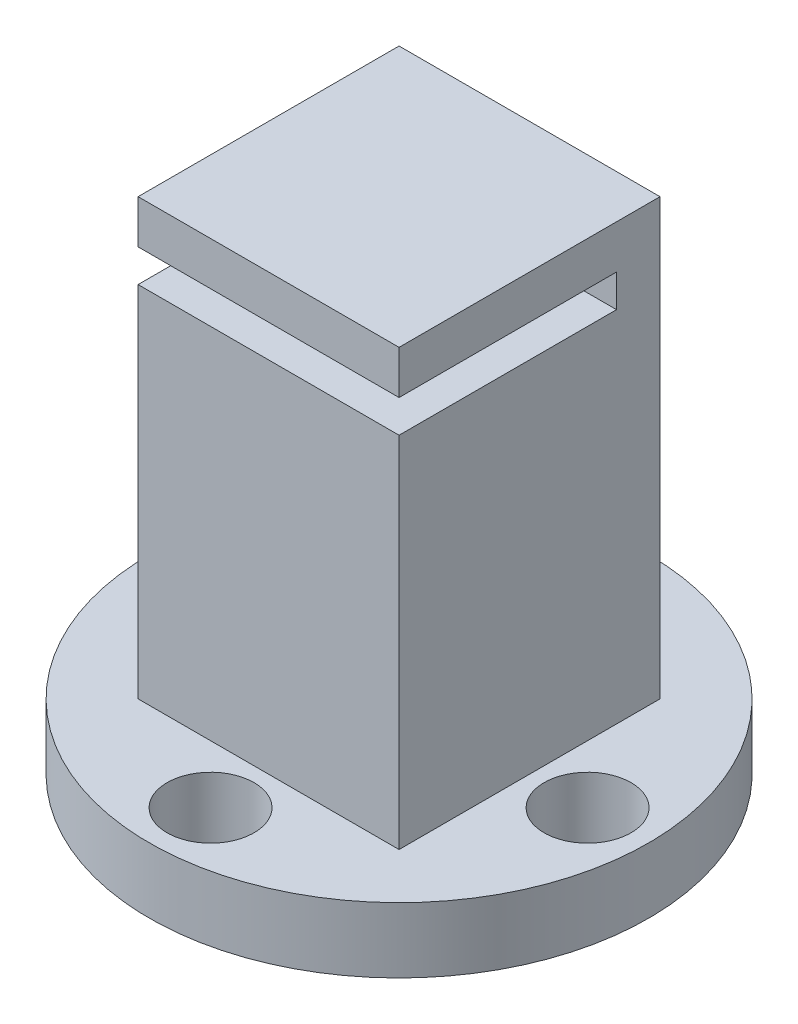
ISO-10303-21;
HEADER;
FILE_DESCRIPTION(('STEP AP214'),'2;1');
FILE_NAME('part.step','',(''),(''),'','','');
FILE_SCHEMA(('AUTOMOTIVE_DESIGN { 1 0 10303 214 1 1 1 1 }'));
ENDSEC;
DATA;
#1=APPLICATION_CONTEXT('core data for automotive mechanical design processes');
#2=APPLICATION_PROTOCOL_DEFINITION('international standard','automotive_design',2000,#1);
#3=PRODUCT_CONTEXT('',#1,'mechanical');
#4=PRODUCT('Part','Part','',(#3));
#5=PRODUCT_RELATED_PRODUCT_CATEGORY('part','',(#4));
#6=PRODUCT_DEFINITION_FORMATION('','',#4);
#7=PRODUCT_DEFINITION_CONTEXT('part definition',#1,'design');
#8=PRODUCT_DEFINITION('design','',#6,#7);
#9=PRODUCT_DEFINITION_SHAPE('','',#8);
#10=(LENGTH_UNIT() NAMED_UNIT(*) SI_UNIT(.MILLI.,.METRE.));
#11=(NAMED_UNIT(*) PLANE_ANGLE_UNIT() SI_UNIT($,.RADIAN.));
#12=(NAMED_UNIT(*) SI_UNIT($,.STERADIAN.) SOLID_ANGLE_UNIT());
#13=UNCERTAINTY_MEASURE_WITH_UNIT(LENGTH_MEASURE(1.E-05),#10,'distance_accuracy_value','');
#14=(GEOMETRIC_REPRESENTATION_CONTEXT(3) GLOBAL_UNCERTAINTY_ASSIGNED_CONTEXT((#13)) GLOBAL_UNIT_ASSIGNED_CONTEXT((#10,
#11,#12)) REPRESENTATION_CONTEXT('',''));
#15=CARTESIAN_POINT('',(0.,0.,0.));
#16=DIRECTION('',(0.,0.,1.));
#17=DIRECTION('',(1.,0.,0.));
#18=AXIS2_PLACEMENT_3D('',#15,#16,#17);
#19=CARTESIAN_POINT('',(0.,20.,0.));
#20=DIRECTION('',(0.,0.,-1.));
#21=DIRECTION('',(-1.,0.,0.));
#22=AXIS2_PLACEMENT_3D('',#19,#20,#21);
#23=PLANE('',#22);
#24=DIRECTION('',(0.,-1.,0.));
#25=VECTOR('',#24,1.);
#26=CARTESIAN_POINT('',(0.,20.,0.));
#27=LINE('',#26,#25);
#28=CARTESIAN_POINT('',(0.,20.,0.));
#29=VERTEX_POINT('',#28);
#30=CARTESIAN_POINT('',(0.,18.,0.));
#31=VERTEX_POINT('',#30);
#32=EDGE_CURVE('E11',#29,#31,#27,.T.);
#33=ORIENTED_EDGE('',*,*,#32,.T.);
#34=DIRECTION('',(-1.,0.,0.));
#35=VECTOR('',#34,1.);
#36=CARTESIAN_POINT('',(0.,18.,0.));
#37=LINE('',#36,#35);
#38=CARTESIAN_POINT('',(12.,18.,0.));
#39=VERTEX_POINT('',#38);
#40=EDGE_CURVE('E121',#39,#31,#37,.T.);
#41=ORIENTED_EDGE('',*,*,#40,.F.);
#42=DIRECTION('',(0.,-1.,0.));
#43=VECTOR('',#42,1.);
#44=CARTESIAN_POINT('',(12.,20.,0.));
#45=LINE('',#44,#43);
#46=CARTESIAN_POINT('',(12.,20.,0.));
#47=VERTEX_POINT('',#46);
#48=EDGE_CURVE('E120',#47,#39,#45,.T.);
#49=ORIENTED_EDGE('',*,*,#48,.F.);
#50=DIRECTION('',(1.,0.,0.));
#51=VECTOR('',#50,1.);
#52=CARTESIAN_POINT('',(0.,20.,0.));
#53=LINE('',#52,#51);
#54=EDGE_CURVE('E106',#29,#47,#53,.T.);
#55=ORIENTED_EDGE('',*,*,#54,.F.);
#56=EDGE_LOOP('',(#33,#41,#49,#55));
#57=FACE_BOUND('',#56,.T.);
#58=ADVANCED_FACE('F39',(#57),#23,.F.);
#59=CARTESIAN_POINT('',(0.,20.,0.));
#60=DIRECTION('',(1.,0.,0.));
#61=DIRECTION('',(0.,0.,-1.));
#62=AXIS2_PLACEMENT_3D('',#59,#60,#61);
#63=PLANE('',#62);
#64=DIRECTION('',(0.,-1.,0.));
#65=VECTOR('',#64,1.);
#66=CARTESIAN_POINT('',(0.,18.,-10.));
#67=LINE('',#66,#65);
#68=CARTESIAN_POINT('',(0.,18.,-10.));
#69=VERTEX_POINT('',#68);
#70=CARTESIAN_POINT('',(0.,16.5,-10.));
#71=VERTEX_POINT('',#70);
#72=EDGE_CURVE('E179',#69,#71,#67,.T.);
#73=ORIENTED_EDGE('',*,*,#72,.F.);
#74=DIRECTION('',(0.,0.,1.));
#75=VECTOR('',#74,1.);
#76=CARTESIAN_POINT('',(0.,18.,-10.));
#77=LINE('',#76,#75);
#78=EDGE_CURVE('E88',#69,#31,#77,.T.);
#79=ORIENTED_EDGE('',*,*,#78,.T.);
#80=ORIENTED_EDGE('',*,*,#32,.F.);
#81=DIRECTION('',(0.,0.,1.));
#82=VECTOR('',#81,1.);
#83=CARTESIAN_POINT('',(0.,20.,0.));
#84=LINE('',#83,#82);
#85=CARTESIAN_POINT('',(0.,20.,-12.));
#86=VERTEX_POINT('',#85);
#87=EDGE_CURVE('E113',#86,#29,#84,.T.);
#88=ORIENTED_EDGE('',*,*,#87,.F.);
#89=DIRECTION('',(0.,-1.,0.));
#90=VECTOR('',#89,1.);
#91=CARTESIAN_POINT('',(0.,20.,-12.));
#92=LINE('',#91,#90);
#93=CARTESIAN_POINT('',(0.,0.,-12.));
#94=VERTEX_POINT('',#93);
#95=EDGE_CURVE('E132',#86,#94,#92,.T.);
#96=ORIENTED_EDGE('',*,*,#95,.T.);
#97=DIRECTION('',(0.,0.,1.));
#98=VECTOR('',#97,1.);
#99=CARTESIAN_POINT('',(0.,0.,0.));
#100=LINE('',#99,#98);
#101=CARTESIAN_POINT('',(0.,0.,0.));
#102=VERTEX_POINT('',#101);
#103=EDGE_CURVE('E136',#94,#102,#100,.T.);
#104=ORIENTED_EDGE('',*,*,#103,.T.);
#105=CARTESIAN_POINT('',(0.,16.5,0.));
#106=VERTEX_POINT('',#105);
#107=EDGE_CURVE('E48',#106,#102,#27,.T.);
#108=ORIENTED_EDGE('',*,*,#107,.F.);
#109=DIRECTION('',(0.,0.,1.));
#110=VECTOR('',#109,1.);
#111=CARTESIAN_POINT('',(0.,16.5,-10.));
#112=LINE('',#111,#110);
#113=EDGE_CURVE('E176',#71,#106,#112,.T.);
#114=ORIENTED_EDGE('',*,*,#113,.F.);
#115=EDGE_LOOP('',(#73,#79,#80,#88,#96,#104,#108,#114));
#116=FACE_BOUND('',#115,.T.);
#117=ADVANCED_FACE('F41',(#116),#63,.F.);
#118=CARTESIAN_POINT('',(12.,16.5,0.));
#119=VERTEX_POINT('',#118);
#120=CARTESIAN_POINT('',(12.,0.,0.));
#121=VERTEX_POINT('',#120);
#122=EDGE_CURVE('E125',#119,#121,#45,.T.);
#123=ORIENTED_EDGE('',*,*,#122,.F.);
#124=DIRECTION('',(1.,0.,0.));
#125=VECTOR('',#124,1.);
#126=CARTESIAN_POINT('',(0.,16.5,0.));
#127=LINE('',#126,#125);
#128=EDGE_CURVE('E202',#106,#119,#127,.T.);
#129=ORIENTED_EDGE('',*,*,#128,.F.);
#130=ORIENTED_EDGE('',*,*,#107,.T.);
#131=DIRECTION('',(1.,0.,0.));
#132=VECTOR('',#131,1.);
#133=CARTESIAN_POINT('',(0.,0.,0.));
#134=LINE('',#133,#132);
#135=EDGE_CURVE('E140',#102,#121,#134,.T.);
#136=ORIENTED_EDGE('',*,*,#135,.T.);
#137=EDGE_LOOP('',(#123,#129,#130,#136));
#138=FACE_BOUND('',#137,.T.);
#139=ADVANCED_FACE('F164',(#138),#23,.F.);
#140=CARTESIAN_POINT('',(12.,20.,0.));
#141=DIRECTION('',(-1.,0.,0.));
#142=DIRECTION('',(0.,0.,1.));
#143=AXIS2_PLACEMENT_3D('',#140,#141,#142);
#144=PLANE('',#143);
#145=ORIENTED_EDGE('',*,*,#48,.T.);
#146=DIRECTION('',(0.,0.,1.));
#147=VECTOR('',#146,1.);
#148=CARTESIAN_POINT('',(12.,18.,-10.));
#149=LINE('',#148,#147);
#150=CARTESIAN_POINT('',(12.,18.,-10.));
#151=VERTEX_POINT('',#150);
#152=EDGE_CURVE('E191',#151,#39,#149,.T.);
#153=ORIENTED_EDGE('',*,*,#152,.F.);
#154=DIRECTION('',(0.,1.,0.));
#155=VECTOR('',#154,1.);
#156=CARTESIAN_POINT('',(12.,18.,-10.));
#157=LINE('',#156,#155);
#158=CARTESIAN_POINT('',(12.,16.5,-10.));
#159=VERTEX_POINT('',#158);
#160=EDGE_CURVE('E178',#159,#151,#157,.T.);
#161=ORIENTED_EDGE('',*,*,#160,.F.);
#162=DIRECTION('',(0.,0.,1.));
#163=VECTOR('',#162,1.);
#164=CARTESIAN_POINT('',(12.,16.5,-10.));
#165=LINE('',#164,#163);
#166=EDGE_CURVE('E160',#159,#119,#165,.T.);
#167=ORIENTED_EDGE('',*,*,#166,.T.);
#168=ORIENTED_EDGE('',*,*,#122,.T.);
#169=DIRECTION('',(0.,0.,-1.));
#170=VECTOR('',#169,1.);
#171=CARTESIAN_POINT('',(12.,0.,0.));
#172=LINE('',#171,#170);
#173=CARTESIAN_POINT('',(12.,0.,-12.));
#174=VERTEX_POINT('',#173);
#175=EDGE_CURVE('E77',#121,#174,#172,.T.);
#176=ORIENTED_EDGE('',*,*,#175,.T.);
#177=DIRECTION('',(0.,-1.,0.));
#178=VECTOR('',#177,1.);
#179=CARTESIAN_POINT('',(12.,20.,-12.));
#180=LINE('',#179,#178);
#181=CARTESIAN_POINT('',(12.,20.,-12.));
#182=VERTEX_POINT('',#181);
#183=EDGE_CURVE('E128',#182,#174,#180,.T.);
#184=ORIENTED_EDGE('',*,*,#183,.F.);
#185=DIRECTION('',(0.,0.,-1.));
#186=VECTOR('',#185,1.);
#187=CARTESIAN_POINT('',(12.,20.,0.));
#188=LINE('',#187,#186);
#189=EDGE_CURVE('E110',#47,#182,#188,.T.);
#190=ORIENTED_EDGE('',*,*,#189,.F.);
#191=EDGE_LOOP('',(#145,#153,#161,#167,#168,#176,#184,#190));
#192=FACE_BOUND('',#191,.T.);
#193=ADVANCED_FACE('F126',(#192),#144,.F.);
#194=CARTESIAN_POINT('',(0.,20.,-12.));
#195=DIRECTION('',(0.,0.,1.));
#196=DIRECTION('',(1.,0.,0.));
#197=AXIS2_PLACEMENT_3D('',#194,#195,#196);
#198=PLANE('',#197);
#199=DIRECTION('',(-1.,0.,0.));
#200=VECTOR('',#199,1.);
#201=CARTESIAN_POINT('',(0.,0.,-12.));
#202=LINE('',#201,#200);
#203=EDGE_CURVE('E146',#174,#94,#202,.T.);
#204=ORIENTED_EDGE('',*,*,#203,.T.);
#205=ORIENTED_EDGE('',*,*,#95,.F.);
#206=DIRECTION('',(-1.,0.,0.));
#207=VECTOR('',#206,1.);
#208=CARTESIAN_POINT('',(0.,20.,-12.));
#209=LINE('',#208,#207);
#210=EDGE_CURVE('E64',#182,#86,#209,.T.);
#211=ORIENTED_EDGE('',*,*,#210,.F.);
#212=ORIENTED_EDGE('',*,*,#183,.T.);
#213=EDGE_LOOP('',(#204,#205,#211,#212));
#214=FACE_BOUND('',#213,.T.);
#215=ADVANCED_FACE('F274',(#214),#198,.F.);
#216=CARTESIAN_POINT('',(0.,20.,0.));
#217=DIRECTION('',(0.,-1.,0.));
#218=DIRECTION('',(0.,0.,-1.));
#219=AXIS2_PLACEMENT_3D('',#216,#217,#218);
#220=PLANE('',#219);
#221=ORIENTED_EDGE('',*,*,#87,.T.);
#222=ORIENTED_EDGE('',*,*,#54,.T.);
#223=ORIENTED_EDGE('',*,*,#189,.T.);
#224=ORIENTED_EDGE('',*,*,#210,.T.);
#225=EDGE_LOOP('',(#221,#222,#223,#224));
#226=FACE_BOUND('',#225,.T.);
#227=ADVANCED_FACE('F108',(#226),#220,.F.);
#228=CARTESIAN_POINT('',(0.,18.,-10.));
#229=DIRECTION('',(0.,1.,0.));
#230=DIRECTION('',(0.,0.,1.));
#231=AXIS2_PLACEMENT_3D('',#228,#229,#230);
#232=PLANE('',#231);
#233=ORIENTED_EDGE('',*,*,#40,.T.);
#234=ORIENTED_EDGE('',*,*,#78,.F.);
#235=DIRECTION('',(-1.,0.,0.));
#236=VECTOR('',#235,1.);
#237=CARTESIAN_POINT('',(0.,18.,-10.));
#238=LINE('',#237,#236);
#239=EDGE_CURVE('E183',#151,#69,#238,.T.);
#240=ORIENTED_EDGE('',*,*,#239,.F.);
#241=ORIENTED_EDGE('',*,*,#152,.T.);
#242=EDGE_LOOP('',(#233,#234,#240,#241));
#243=FACE_BOUND('',#242,.T.);
#244=ADVANCED_FACE('F282',(#243),#232,.F.);
#245=CARTESIAN_POINT('',(0.,16.5,-10.));
#246=DIRECTION('',(0.,-1.,0.));
#247=DIRECTION('',(0.,0.,-1.));
#248=AXIS2_PLACEMENT_3D('',#245,#246,#247);
#249=PLANE('',#248);
#250=ORIENTED_EDGE('',*,*,#128,.T.);
#251=ORIENTED_EDGE('',*,*,#166,.F.);
#252=DIRECTION('',(1.,0.,0.));
#253=VECTOR('',#252,1.);
#254=CARTESIAN_POINT('',(0.,16.5,-10.));
#255=LINE('',#254,#253);
#256=EDGE_CURVE('E55',#71,#159,#255,.T.);
#257=ORIENTED_EDGE('',*,*,#256,.F.);
#258=ORIENTED_EDGE('',*,*,#113,.T.);
#259=EDGE_LOOP('',(#250,#251,#257,#258));
#260=FACE_BOUND('',#259,.T.);
#261=ADVANCED_FACE('F174',(#260),#249,.F.);
#262=CARTESIAN_POINT('',(0.,0.,-10.));
#263=DIRECTION('',(0.,0.,1.));
#264=DIRECTION('',(1.,0.,0.));
#265=AXIS2_PLACEMENT_3D('',#262,#263,#264);
#266=PLANE('',#265);
#267=ORIENTED_EDGE('',*,*,#72,.T.);
#268=ORIENTED_EDGE('',*,*,#256,.T.);
#269=ORIENTED_EDGE('',*,*,#160,.T.);
#270=ORIENTED_EDGE('',*,*,#239,.T.);
#271=EDGE_LOOP('',(#267,#268,#269,#270));
#272=FACE_BOUND('',#271,.T.);
#273=ADVANCED_FACE('F182',(#272),#266,.T.);
#274=CARTESIAN_POINT('',(6.,-3.,-6.));
#275=DIRECTION('',(0.,-1.,0.));
#276=DIRECTION('',(0.,0.,-1.));
#277=AXIS2_PLACEMENT_3D('',#274,#275,#276);
#278=PLANE('',#277);
#279=CARTESIAN_POINT('',(-2.66847448782835,-3.,-5.99999999999994));
#280=DIRECTION('',(0.,-1.,0.));
#281=DIRECTION('',(0.,0.,-1.));
#282=AXIS2_PLACEMENT_3D('',#279,#280,#281);
#283=CIRCLE('',#282,2.);
#284=CARTESIAN_POINT('',(-2.66847448782835,-3.,-7.99999999999994));
#285=VERTEX_POINT('',#284);
#286=EDGE_CURVE('E228',#285,#285,#283,.T.);
#287=ORIENTED_EDGE('',*,*,#286,.F.);
#288=EDGE_LOOP('',(#287));
#289=FACE_BOUND('',#288,.T.);
#290=CARTESIAN_POINT('',(14.6684744878283,-3.,-6.));
#291=DIRECTION('',(0.,-1.,0.));
#292=DIRECTION('',(0.,0.,-1.));
#293=AXIS2_PLACEMENT_3D('',#290,#291,#292);
#294=CIRCLE('',#293,2.);
#295=CARTESIAN_POINT('',(14.6684744878283,-3.,-8.));
#296=VERTEX_POINT('',#295);
#297=EDGE_CURVE('E212',#296,#296,#294,.T.);
#298=ORIENTED_EDGE('',*,*,#297,.F.);
#299=EDGE_LOOP('',(#298));
#300=FACE_BOUND('',#299,.T.);
#301=CARTESIAN_POINT('',(6.,-3.,-6.));
#302=DIRECTION('',(0.,-1.,0.));
#303=DIRECTION('',(0.,0.,-1.));
#304=AXIS2_PLACEMENT_3D('',#301,#302,#303);
#305=CIRCLE('',#304,11.4781788361966);
#306=CARTESIAN_POINT('',(6.,-3.,-17.4781788361966));
#307=VERTEX_POINT('',#306);
#308=EDGE_CURVE('E204',#307,#307,#305,.T.);
#309=ORIENTED_EDGE('',*,*,#308,.T.);
#310=EDGE_LOOP('',(#309));
#311=FACE_BOUND('',#310,.T.);
#312=CARTESIAN_POINT('',(5.99999999999997,-3.,-14.6684744878283));
#313=DIRECTION('',(0.,-1.,0.));
#314=DIRECTION('',(0.,0.,-1.));
#315=AXIS2_PLACEMENT_3D('',#312,#313,#314);
#316=CIRCLE('',#315,2.00000000000001);
#317=CARTESIAN_POINT('',(5.99999999999997,-3.,-16.6684744878284));
#318=VERTEX_POINT('',#317);
#319=EDGE_CURVE('E220',#318,#318,#316,.T.);
#320=ORIENTED_EDGE('',*,*,#319,.F.);
#321=EDGE_LOOP('',(#320));
#322=FACE_BOUND('',#321,.T.);
#323=CARTESIAN_POINT('',(6.00000000000009,-3.,2.66847448782835));
#324=DIRECTION('',(0.,-1.,0.));
#325=DIRECTION('',(0.,0.,-1.));
#326=AXIS2_PLACEMENT_3D('',#323,#324,#325);
#327=CIRCLE('',#326,2.);
#328=CARTESIAN_POINT('',(6.00000000000009,-3.,0.668474487828347));
#329=VERTEX_POINT('',#328);
#330=EDGE_CURVE('E236',#329,#329,#327,.T.);
#331=ORIENTED_EDGE('',*,*,#330,.F.);
#332=EDGE_LOOP('',(#331));
#333=FACE_BOUND('',#332,.T.);
#334=ADVANCED_FACE('F251',(#289,#300,#311,#322,#333),#278,.T.);
#335=CARTESIAN_POINT('',(6.,0.,-6.));
#336=DIRECTION('',(0.,-1.,0.));
#337=DIRECTION('',(0.,0.,-1.));
#338=AXIS2_PLACEMENT_3D('',#335,#336,#337);
#339=PLANE('',#338);
#340=ORIENTED_EDGE('',*,*,#103,.F.);
#341=ORIENTED_EDGE('',*,*,#203,.F.);
#342=ORIENTED_EDGE('',*,*,#175,.F.);
#343=ORIENTED_EDGE('',*,*,#135,.F.);
#344=EDGE_LOOP('',(#340,#341,#342,#343));
#345=FACE_BOUND('',#344,.T.);
#346=CARTESIAN_POINT('',(6.,0.,-6.));
#347=DIRECTION('',(0.,-1.,0.));
#348=DIRECTION('',(0.,0.,-1.));
#349=AXIS2_PLACEMENT_3D('',#346,#347,#348);
#350=CIRCLE('',#349,11.4781788361966);
#351=CARTESIAN_POINT('',(6.,0.,-17.4781788361966));
#352=VERTEX_POINT('',#351);
#353=EDGE_CURVE('E208',#352,#352,#350,.T.);
#354=ORIENTED_EDGE('',*,*,#353,.F.);
#355=EDGE_LOOP('',(#354));
#356=FACE_BOUND('',#355,.T.);
#357=CARTESIAN_POINT('',(14.6684744878283,0.,-6.));
#358=DIRECTION('',(0.,-1.,0.));
#359=DIRECTION('',(0.,0.,-1.));
#360=AXIS2_PLACEMENT_3D('',#357,#358,#359);
#361=CIRCLE('',#360,2.);
#362=CARTESIAN_POINT('',(14.6684744878283,0.,-8.));
#363=VERTEX_POINT('',#362);
#364=EDGE_CURVE('E216',#363,#363,#361,.T.);
#365=ORIENTED_EDGE('',*,*,#364,.T.);
#366=EDGE_LOOP('',(#365));
#367=FACE_BOUND('',#366,.T.);
#368=CARTESIAN_POINT('',(5.99999999999997,0.,-14.6684744878283));
#369=DIRECTION('',(0.,-1.,0.));
#370=DIRECTION('',(0.,0.,-1.));
#371=AXIS2_PLACEMENT_3D('',#368,#369,#370);
#372=CIRCLE('',#371,2.00000000000001);
#373=CARTESIAN_POINT('',(5.99999999999997,0.,-16.6684744878284));
#374=VERTEX_POINT('',#373);
#375=EDGE_CURVE('E224',#374,#374,#372,.T.);
#376=ORIENTED_EDGE('',*,*,#375,.T.);
#377=EDGE_LOOP('',(#376));
#378=FACE_BOUND('',#377,.T.);
#379=CARTESIAN_POINT('',(-2.66847448782835,0.,-5.99999999999994));
#380=DIRECTION('',(0.,-1.,0.));
#381=DIRECTION('',(0.,0.,-1.));
#382=AXIS2_PLACEMENT_3D('',#379,#380,#381);
#383=CIRCLE('',#382,2.);
#384=CARTESIAN_POINT('',(-2.66847448782835,0.,-7.99999999999994));
#385=VERTEX_POINT('',#384);
#386=EDGE_CURVE('E232',#385,#385,#383,.T.);
#387=ORIENTED_EDGE('',*,*,#386,.T.);
#388=EDGE_LOOP('',(#387));
#389=FACE_BOUND('',#388,.T.);
#390=CARTESIAN_POINT('',(6.00000000000009,0.,2.66847448782835));
#391=DIRECTION('',(0.,-1.,0.));
#392=DIRECTION('',(0.,0.,-1.));
#393=AXIS2_PLACEMENT_3D('',#390,#391,#392);
#394=CIRCLE('',#393,2.);
#395=CARTESIAN_POINT('',(6.00000000000009,0.,0.668474487828347));
#396=VERTEX_POINT('',#395);
#397=EDGE_CURVE('E240',#396,#396,#394,.T.);
#398=ORIENTED_EDGE('',*,*,#397,.T.);
#399=EDGE_LOOP('',(#398));
#400=FACE_BOUND('',#399,.T.);
#401=ADVANCED_FACE('F168',(#345,#356,#367,#378,#389,#400),#339,.F.);
#402=CARTESIAN_POINT('',(6.,-3.,-6.));
#403=DIRECTION('',(0.,1.,0.));
#404=DIRECTION('',(0.,0.,1.));
#405=AXIS2_PLACEMENT_3D('',#402,#403,#404);
#406=CYLINDRICAL_SURFACE('',#405,11.4781788361966);
#407=ORIENTED_EDGE('',*,*,#308,.F.);
#408=EDGE_LOOP('',(#407));
#409=FACE_BOUND('',#408,.T.);
#410=ORIENTED_EDGE('',*,*,#353,.T.);
#411=EDGE_LOOP('',(#410));
#412=FACE_BOUND('',#411,.T.);
#413=ADVANCED_FACE('F259',(#409,#412),#406,.T.);
#414=CARTESIAN_POINT('',(14.6684744878283,-3.,-6.));
#415=DIRECTION('',(0.,1.,0.));
#416=DIRECTION('',(0.,0.,1.));
#417=AXIS2_PLACEMENT_3D('',#414,#415,#416);
#418=CYLINDRICAL_SURFACE('',#417,2.);
#419=ORIENTED_EDGE('',*,*,#297,.T.);
#420=EDGE_LOOP('',(#419));
#421=FACE_BOUND('',#420,.T.);
#422=ORIENTED_EDGE('',*,*,#364,.F.);
#423=EDGE_LOOP('',(#422));
#424=FACE_BOUND('',#423,.T.);
#425=ADVANCED_FACE('F288',(#421,#424),#418,.F.);
#426=CARTESIAN_POINT('',(5.99999999999997,-3.,-14.6684744878283));
#427=DIRECTION('',(0.,1.,0.));
#428=DIRECTION('',(0.,0.,1.));
#429=AXIS2_PLACEMENT_3D('',#426,#427,#428);
#430=CYLINDRICAL_SURFACE('',#429,2.00000000000001);
#431=ORIENTED_EDGE('',*,*,#319,.T.);
#432=EDGE_LOOP('',(#431));
#433=FACE_BOUND('',#432,.T.);
#434=ORIENTED_EDGE('',*,*,#375,.F.);
#435=EDGE_LOOP('',(#434));
#436=FACE_BOUND('',#435,.T.);
#437=ADVANCED_FACE('F293',(#433,#436),#430,.F.);
#438=CARTESIAN_POINT('',(-2.66847448782835,-3.,-5.99999999999994));
#439=DIRECTION('',(0.,1.,0.));
#440=DIRECTION('',(0.,0.,1.));
#441=AXIS2_PLACEMENT_3D('',#438,#439,#440);
#442=CYLINDRICAL_SURFACE('',#441,2.);
#443=ORIENTED_EDGE('',*,*,#286,.T.);
#444=EDGE_LOOP('',(#443));
#445=FACE_BOUND('',#444,.T.);
#446=ORIENTED_EDGE('',*,*,#386,.F.);
#447=EDGE_LOOP('',(#446));
#448=FACE_BOUND('',#447,.T.);
#449=ADVANCED_FACE('F307',(#445,#448),#442,.F.);
#450=CARTESIAN_POINT('',(6.00000000000009,-3.,2.66847448782835));
#451=DIRECTION('',(0.,1.,0.));
#452=DIRECTION('',(0.,0.,1.));
#453=AXIS2_PLACEMENT_3D('',#450,#451,#452);
#454=CYLINDRICAL_SURFACE('',#453,2.);
#455=ORIENTED_EDGE('',*,*,#330,.T.);
#456=EDGE_LOOP('',(#455));
#457=FACE_BOUND('',#456,.T.);
#458=ORIENTED_EDGE('',*,*,#397,.F.);
#459=EDGE_LOOP('',(#458));
#460=FACE_BOUND('',#459,.T.);
#461=ADVANCED_FACE('F248',(#457,#460),#454,.F.);
#462=CLOSED_SHELL('',(#58,#117,#139,#193,#215,#227,#244,#261,#273,#334,#401,#413,#425,#437,#449,#461));
#463=MANIFOLD_SOLID_BREP('B2',#462);
#464=ADVANCED_BREP_SHAPE_REPRESENTATION('',(#18,#463),#14);
#465=SHAPE_DEFINITION_REPRESENTATION(#9,#464);
ENDSEC;
END-ISO-10303-21;
